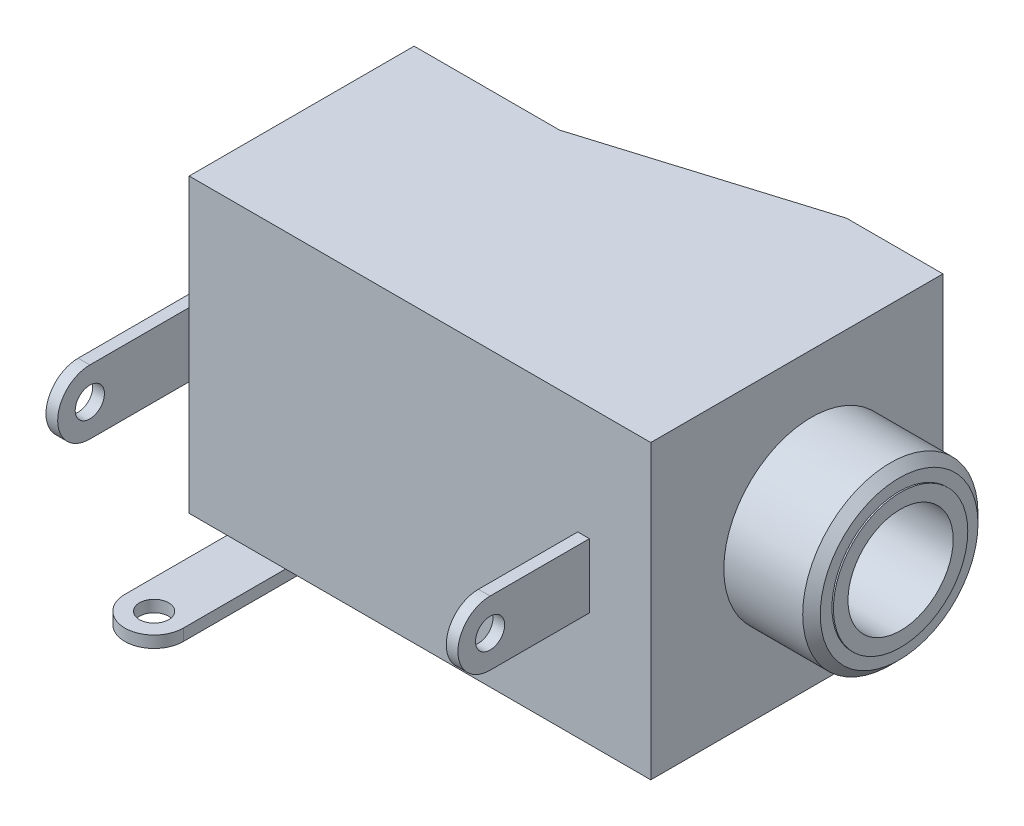
ISO-10303-21;
HEADER;
FILE_DESCRIPTION(('STEP AP214'),'2;1');
FILE_NAME('part.step','',(''),(''),'','','');
FILE_SCHEMA(('AUTOMOTIVE_DESIGN { 1 0 10303 214 1 1 1 1 }'));
ENDSEC;
DATA;
#1=APPLICATION_CONTEXT('core data for automotive mechanical design processes');
#2=APPLICATION_PROTOCOL_DEFINITION('international standard','automotive_design',2000,#1);
#3=PRODUCT_CONTEXT('',#1,'mechanical');
#4=PRODUCT('Part','Part','',(#3));
#5=PRODUCT_RELATED_PRODUCT_CATEGORY('part','',(#4));
#6=PRODUCT_DEFINITION_FORMATION('','',#4);
#7=PRODUCT_DEFINITION_CONTEXT('part definition',#1,'design');
#8=PRODUCT_DEFINITION('design','',#6,#7);
#9=PRODUCT_DEFINITION_SHAPE('','',#8);
#10=(LENGTH_UNIT() NAMED_UNIT(*) SI_UNIT(.MILLI.,.METRE.));
#11=(NAMED_UNIT(*) PLANE_ANGLE_UNIT() SI_UNIT($,.RADIAN.));
#12=(NAMED_UNIT(*) SI_UNIT($,.STERADIAN.) SOLID_ANGLE_UNIT());
#13=UNCERTAINTY_MEASURE_WITH_UNIT(LENGTH_MEASURE(1.E-05),#10,'distance_accuracy_value','');
#14=(GEOMETRIC_REPRESENTATION_CONTEXT(3) GLOBAL_UNCERTAINTY_ASSIGNED_CONTEXT((#13)) GLOBAL_UNIT_ASSIGNED_CONTEXT((#10,
#11,#12)) REPRESENTATION_CONTEXT('',''));
#15=CARTESIAN_POINT('',(0.,0.,0.));
#16=DIRECTION('',(0.,0.,1.));
#17=DIRECTION('',(1.,0.,0.));
#18=AXIS2_PLACEMENT_3D('',#15,#16,#17);
#19=CARTESIAN_POINT('',(0.,0.,5.3));
#20=DIRECTION('',(0.,0.,1.));
#21=DIRECTION('',(1.,0.,0.));
#22=AXIS2_PLACEMENT_3D('',#19,#20,#21);
#23=PLANE('',#22);
#24=DIRECTION('',(1.,0.,0.));
#25=VECTOR('',#24,1.);
#26=CARTESIAN_POINT('',(-18.8,-5.,5.3));
#27=LINE('',#26,#25);
#28=CARTESIAN_POINT('',(-17.5,-5.,5.3));
#29=VERTEX_POINT('',#28);
#30=CARTESIAN_POINT('',(-15.5,-5.,5.3));
#31=VERTEX_POINT('',#30);
#32=EDGE_CURVE('E269',#29,#31,#27,.T.);
#33=ORIENTED_EDGE('',*,*,#32,.T.);
#34=DIRECTION('',(-1.,0.,0.));
#35=VECTOR('',#34,1.);
#36=CARTESIAN_POINT('',(-3.,-4.99999999999995,5.3));
#37=LINE('',#36,#35);
#38=CARTESIAN_POINT('',(-3.,-4.99999999999995,5.3));
#39=VERTEX_POINT('',#38);
#40=EDGE_CURVE('E247',#39,#31,#37,.T.);
#41=ORIENTED_EDGE('',*,*,#40,.F.);
#42=DIRECTION('',(0.,-1.,0.));
#43=VECTOR('',#42,1.);
#44=CARTESIAN_POINT('',(-3.,-4.99999999999995,5.3));
#45=LINE('',#44,#43);
#46=CARTESIAN_POINT('',(-3.00000000000004,5.00000000000005,5.3));
#47=VERTEX_POINT('',#46);
#48=EDGE_CURVE('E242',#47,#39,#45,.T.);
#49=ORIENTED_EDGE('',*,*,#48,.F.);
#50=DIRECTION('',(1.,0.,0.));
#51=VECTOR('',#50,1.);
#52=CARTESIAN_POINT('',(-15.5,5.,5.3));
#53=LINE('',#52,#51);
#54=CARTESIAN_POINT('',(-18.8,5.,5.3));
#55=VERTEX_POINT('',#54);
#56=EDGE_CURVE('E256',#55,#47,#53,.T.);
#57=ORIENTED_EDGE('',*,*,#56,.F.);
#58=DIRECTION('',(0.,-1.,0.));
#59=VECTOR('',#58,1.);
#60=CARTESIAN_POINT('',(-18.8,5.,5.3));
#61=LINE('',#60,#59);
#62=CARTESIAN_POINT('',(-18.8,1.1,5.3));
#63=VERTEX_POINT('',#62);
#64=EDGE_CURVE('E258',#55,#63,#61,.T.);
#65=ORIENTED_EDGE('',*,*,#64,.T.);
#66=DIRECTION('',(0.,-1.,0.));
#67=VECTOR('',#66,1.);
#68=CARTESIAN_POINT('',(-18.8,1.1,5.3));
#69=LINE('',#68,#67);
#70=CARTESIAN_POINT('',(-18.8,-1.1,5.3));
#71=VERTEX_POINT('',#70);
#72=EDGE_CURVE('E266',#63,#71,#69,.T.);
#73=ORIENTED_EDGE('',*,*,#72,.T.);
#74=CARTESIAN_POINT('',(-18.8,-5.,5.3));
#75=VERTEX_POINT('',#74);
#76=EDGE_CURVE('E265',#71,#75,#69,.T.);
#77=ORIENTED_EDGE('',*,*,#76,.T.);
#78=EDGE_CURVE('E270',#75,#29,#27,.T.);
#79=ORIENTED_EDGE('',*,*,#78,.T.);
#80=EDGE_LOOP('',(#33,#41,#49,#57,#65,#73,#77,#79));
#81=FACE_BOUND('',#80,.T.);
#82=DIRECTION('',(1.,0.,0.));
#83=VECTOR('',#82,1.);
#84=CARTESIAN_POINT('',(-5.5,-1.1,5.3));
#85=LINE('',#84,#83);
#86=CARTESIAN_POINT('',(-5.5,-1.1,5.3));
#87=VERTEX_POINT('',#86);
#88=CARTESIAN_POINT('',(-5.1,-1.1,5.3));
#89=VERTEX_POINT('',#88);
#90=EDGE_CURVE('E61',#87,#89,#85,.T.);
#91=ORIENTED_EDGE('',*,*,#90,.F.);
#92=DIRECTION('',(0.,1.,0.));
#93=VECTOR('',#92,1.);
#94=CARTESIAN_POINT('',(-5.5,-1.1,5.3));
#95=LINE('',#94,#93);
#96=CARTESIAN_POINT('',(-5.5,1.1,5.3));
#97=VERTEX_POINT('',#96);
#98=EDGE_CURVE('E56',#87,#97,#95,.T.);
#99=ORIENTED_EDGE('',*,*,#98,.T.);
#100=DIRECTION('',(1.,0.,0.));
#101=VECTOR('',#100,1.);
#102=CARTESIAN_POINT('',(-5.5,1.1,5.3));
#103=LINE('',#102,#101);
#104=CARTESIAN_POINT('',(-5.1,1.1,5.3));
#105=VERTEX_POINT('',#104);
#106=EDGE_CURVE('E215',#97,#105,#103,.T.);
#107=ORIENTED_EDGE('',*,*,#106,.T.);
#108=DIRECTION('',(0.,1.,0.));
#109=VECTOR('',#108,1.);
#110=CARTESIAN_POINT('',(-5.1,-1.1,5.3));
#111=LINE('',#110,#109);
#112=EDGE_CURVE('E200',#89,#105,#111,.T.);
#113=ORIENTED_EDGE('',*,*,#112,.F.);
#114=EDGE_LOOP('',(#91,#99,#107,#113));
#115=FACE_BOUND('',#114,.T.);
#116=ADVANCED_FACE('F41',(#81,#115),#23,.T.);
#117=CARTESIAN_POINT('',(-15.5,-5.,0.));
#118=DIRECTION('',(-1.,0.,0.));
#119=DIRECTION('',(0.,-1.,0.));
#120=AXIS2_PLACEMENT_3D('',#117,#118,#119);
#121=PLANE('',#120);
#122=DIRECTION('',(0.,0.,-1.));
#123=VECTOR('',#122,1.);
#124=CARTESIAN_POINT('',(-15.5,-5.,-4.7));
#125=LINE('',#124,#123);
#126=CARTESIAN_POINT('',(-15.5,-5.,0.));
#127=VERTEX_POINT('',#126);
#128=EDGE_CURVE('E232',#31,#127,#125,.T.);
#129=ORIENTED_EDGE('',*,*,#128,.F.);
#130=DIRECTION('',(0.,0.,-1.));
#131=VECTOR('',#130,1.);
#132=CARTESIAN_POINT('',(-15.5,-5.,9.8));
#133=LINE('',#132,#131);
#134=CARTESIAN_POINT('',(-15.5,-5.,8.8));
#135=VERTEX_POINT('',#134);
#136=EDGE_CURVE('E467',#31,#135,#133,.F.);
#137=ORIENTED_EDGE('',*,*,#136,.T.);
#138=DIRECTION('',(0.,1.,0.));
#139=VECTOR('',#138,1.);
#140=CARTESIAN_POINT('',(-15.5,-5.4,8.8));
#141=LINE('',#140,#139);
#142=CARTESIAN_POINT('',(-15.5,-5.4,8.8));
#143=VERTEX_POINT('',#142);
#144=EDGE_CURVE('E305',#143,#135,#141,.T.);
#145=ORIENTED_EDGE('',*,*,#144,.F.);
#146=DIRECTION('',(0.,0.,1.));
#147=VECTOR('',#146,1.);
#148=CARTESIAN_POINT('',(-15.5,-5.4,0.));
#149=LINE('',#148,#147);
#150=CARTESIAN_POINT('',(-15.5,-5.4,0.489897948556634));
#151=VERTEX_POINT('',#150);
#152=EDGE_CURVE('E310',#151,#143,#149,.T.);
#153=ORIENTED_EDGE('',*,*,#152,.F.);
#154=CARTESIAN_POINT('',(-15.5,-4.9,0.489897948556634));
#155=DIRECTION('',(1.,0.,0.));
#156=DIRECTION('',(0.,0.,-1.));
#157=AXIS2_PLACEMENT_3D('',#154,#155,#156);
#158=CIRCLE('',#157,0.5);
#159=EDGE_CURVE('E447',#127,#151,#158,.F.);
#160=ORIENTED_EDGE('',*,*,#159,.F.);
#161=EDGE_LOOP('',(#129,#137,#145,#153,#160));
#162=FACE_BOUND('',#161,.T.);
#163=ADVANCED_FACE('F498',(#162),#121,.F.);
#164=CARTESIAN_POINT('',(-18.8,1.1,9.8));
#165=DIRECTION('',(0.,-1.,0.));
#166=DIRECTION('',(0.,0.,-1.));
#167=AXIS2_PLACEMENT_3D('',#164,#165,#166);
#168=PLANE('',#167);
#169=DIRECTION('',(0.,0.,1.));
#170=VECTOR('',#169,1.);
#171=CARTESIAN_POINT('',(-18.8,1.1,5.3));
#172=LINE('',#171,#170);
#173=CARTESIAN_POINT('',(-18.8,1.1,3.55));
#174=VERTEX_POINT('',#173);
#175=EDGE_CURVE('E250',#174,#63,#172,.T.);
#176=ORIENTED_EDGE('',*,*,#175,.F.);
#177=CARTESIAN_POINT('',(-18.7,1.1,4.03989794855663));
#178=DIRECTION('',(0.,1.,0.));
#179=DIRECTION('',(0.,0.,1.));
#180=AXIS2_PLACEMENT_3D('',#177,#178,#179);
#181=CIRCLE('',#180,0.5);
#182=CARTESIAN_POINT('',(-19.2,1.1,4.03989794855663));
#183=VERTEX_POINT('',#182);
#184=EDGE_CURVE('E452',#183,#174,#181,.F.);
#185=ORIENTED_EDGE('',*,*,#184,.F.);
#186=DIRECTION('',(0.,0.,-1.));
#187=VECTOR('',#186,1.);
#188=CARTESIAN_POINT('',(-19.2,1.1,9.8));
#189=LINE('',#188,#187);
#190=CARTESIAN_POINT('',(-19.2,1.1,8.7));
#191=VERTEX_POINT('',#190);
#192=EDGE_CURVE('E399',#191,#183,#189,.T.);
#193=ORIENTED_EDGE('',*,*,#192,.F.);
#194=DIRECTION('',(1.,0.,0.));
#195=VECTOR('',#194,1.);
#196=CARTESIAN_POINT('',(-18.8,1.1,8.7));
#197=LINE('',#196,#195);
#198=CARTESIAN_POINT('',(-18.8,1.1,8.7));
#199=VERTEX_POINT('',#198);
#200=EDGE_CURVE('E395',#199,#191,#197,.F.);
#201=ORIENTED_EDGE('',*,*,#200,.F.);
#202=DIRECTION('',(0.,0.,1.));
#203=VECTOR('',#202,1.);
#204=CARTESIAN_POINT('',(-18.8,1.1,5.3));
#205=LINE('',#204,#203);
#206=EDGE_CURVE('E273',#63,#199,#205,.T.);
#207=ORIENTED_EDGE('',*,*,#206,.F.);
#208=EDGE_LOOP('',(#176,#185,#193,#201,#207));
#209=FACE_BOUND('',#208,.T.);
#210=ADVANCED_FACE('F562',(#209),#168,.F.);
#211=CARTESIAN_POINT('',(-18.8,5.,5.3));
#212=DIRECTION('',(1.,0.,0.));
#213=DIRECTION('',(0.,0.,-1.));
#214=AXIS2_PLACEMENT_3D('',#211,#212,#213);
#215=PLANE('',#214);
#216=DIRECTION('',(0.,0.,1.));
#217=VECTOR('',#216,1.);
#218=CARTESIAN_POINT('',(-18.8,5.,5.3));
#219=LINE('',#218,#217);
#220=CARTESIAN_POINT('',(-18.8,5.00000000000005,-2.4));
#221=VERTEX_POINT('',#220);
#222=EDGE_CURVE('E254',#221,#55,#219,.T.);
#223=ORIENTED_EDGE('',*,*,#222,.F.);
#224=DIRECTION('',(0.,-1.,0.));
#225=VECTOR('',#224,1.);
#226=CARTESIAN_POINT('',(-18.8,5.00000000000005,-2.4));
#227=LINE('',#226,#225);
#228=CARTESIAN_POINT('',(-18.8,-5.,-2.4));
#229=VERTEX_POINT('',#228);
#230=EDGE_CURVE('E229',#221,#229,#227,.T.);
#231=ORIENTED_EDGE('',*,*,#230,.T.);
#232=DIRECTION('',(0.,0.,1.));
#233=VECTOR('',#232,1.);
#234=CARTESIAN_POINT('',(-18.8,-5.,5.3));
#235=LINE('',#234,#233);
#236=EDGE_CURVE('E300',#229,#75,#235,.T.);
#237=ORIENTED_EDGE('',*,*,#236,.T.);
#238=ORIENTED_EDGE('',*,*,#76,.F.);
#239=DIRECTION('',(0.,0.,-1.));
#240=VECTOR('',#239,1.);
#241=CARTESIAN_POINT('',(-18.8,-1.1,5.3));
#242=LINE('',#241,#240);
#243=CARTESIAN_POINT('',(-18.8,-1.1,3.55));
#244=VERTEX_POINT('',#243);
#245=EDGE_CURVE('E389',#244,#71,#242,.F.);
#246=ORIENTED_EDGE('',*,*,#245,.F.);
#247=DIRECTION('',(0.,1.,0.));
#248=VECTOR('',#247,1.);
#249=CARTESIAN_POINT('',(-18.8,5.,3.55));
#250=LINE('',#249,#248);
#251=EDGE_CURVE('E519',#174,#244,#250,.F.);
#252=ORIENTED_EDGE('',*,*,#251,.F.);
#253=ORIENTED_EDGE('',*,*,#175,.T.);
#254=ORIENTED_EDGE('',*,*,#64,.F.);
#255=EDGE_LOOP('',(#223,#231,#237,#238,#246,#252,#253,#254));
#256=FACE_BOUND('',#255,.T.);
#257=ADVANCED_FACE('F575',(#256),#215,.F.);
#258=CARTESIAN_POINT('',(-3.,-5.,5.3));
#259=DIRECTION('',(0.,1.,0.));
#260=DIRECTION('',(0.,0.,1.));
#261=AXIS2_PLACEMENT_3D('',#258,#259,#260);
#262=PLANE('',#261);
#263=ORIENTED_EDGE('',*,*,#236,.F.);
#264=DIRECTION('',(-1.,0.,0.));
#265=VECTOR('',#264,1.);
#266=CARTESIAN_POINT('',(-13.8229610225135,-5.,-2.4));
#267=LINE('',#266,#265);
#268=CARTESIAN_POINT('',(-13.8229610225135,-5.,-2.4));
#269=VERTEX_POINT('',#268);
#270=EDGE_CURVE('E222',#269,#229,#267,.T.);
#271=ORIENTED_EDGE('',*,*,#270,.F.);
#272=DIRECTION('',(-0.956313472988415,0.,0.2923431910971));
#273=VECTOR('',#272,1.);
#274=CARTESIAN_POINT('',(-6.29919766883652,-5.,-4.7));
#275=LINE('',#274,#273);
#276=CARTESIAN_POINT('',(-6.29919766883652,-5.,-4.7));
#277=VERTEX_POINT('',#276);
#278=EDGE_CURVE('E214',#277,#269,#275,.T.);
#279=ORIENTED_EDGE('',*,*,#278,.F.);
#280=DIRECTION('',(-1.,0.,0.));
#281=VECTOR('',#280,1.);
#282=CARTESIAN_POINT('',(-18.8,-5.,-4.7));
#283=LINE('',#282,#281);
#284=CARTESIAN_POINT('',(-3.,-4.99999999999995,-4.7));
#285=VERTEX_POINT('',#284);
#286=EDGE_CURVE('E262',#285,#277,#283,.T.);
#287=ORIENTED_EDGE('',*,*,#286,.F.);
#288=DIRECTION('',(0.,0.,-1.));
#289=VECTOR('',#288,1.);
#290=CARTESIAN_POINT('',(-3.,-4.99999999999995,-4.7));
#291=LINE('',#290,#289);
#292=EDGE_CURVE('E244',#39,#285,#291,.T.);
#293=ORIENTED_EDGE('',*,*,#292,.F.);
#294=ORIENTED_EDGE('',*,*,#40,.T.);
#295=ORIENTED_EDGE('',*,*,#128,.T.);
#296=DIRECTION('',(1.,0.,0.));
#297=VECTOR('',#296,1.);
#298=CARTESIAN_POINT('',(-3.,-5.,0.));
#299=LINE('',#298,#297);
#300=CARTESIAN_POINT('',(-17.5,-5.,0.));
#301=VERTEX_POINT('',#300);
#302=EDGE_CURVE('E379',#301,#127,#299,.T.);
#303=ORIENTED_EDGE('',*,*,#302,.F.);
#304=DIRECTION('',(0.,0.,1.));
#305=VECTOR('',#304,1.);
#306=CARTESIAN_POINT('',(-17.5,-5.,5.3));
#307=LINE('',#306,#305);
#308=EDGE_CURVE('E384',#29,#301,#307,.F.);
#309=ORIENTED_EDGE('',*,*,#308,.F.);
#310=ORIENTED_EDGE('',*,*,#78,.F.);
#311=EDGE_LOOP('',(#263,#271,#279,#287,#293,#294,#295,#303,#309,#310));
#312=FACE_BOUND('',#311,.T.);
#313=ADVANCED_FACE('F542',(#312),#262,.F.);
#314=CARTESIAN_POINT('',(-18.8,-1.1,9.8));
#315=DIRECTION('',(-1.,0.,0.));
#316=DIRECTION('',(0.,0.,1.));
#317=AXIS2_PLACEMENT_3D('',#314,#315,#316);
#318=PLANE('',#317);
#319=CARTESIAN_POINT('',(-18.8,0.,8.7));
#320=DIRECTION('',(1.,0.,0.));
#321=DIRECTION('',(0.,0.,-1.));
#322=AXIS2_PLACEMENT_3D('',#319,#320,#321);
#323=CIRCLE('',#322,0.499999999999988);
#324=CARTESIAN_POINT('',(-18.8,0.,8.20000000000001));
#325=VERTEX_POINT('',#324);
#326=EDGE_CURVE('E1017',#325,#325,#323,.T.);
#327=ORIENTED_EDGE('',*,*,#326,.F.);
#328=EDGE_LOOP('',(#327));
#329=FACE_BOUND('',#328,.T.);
#330=CARTESIAN_POINT('',(-18.8,0.,8.7));
#331=DIRECTION('',(-1.,0.,0.));
#332=DIRECTION('',(0.,0.,1.));
#333=AXIS2_PLACEMENT_3D('',#330,#331,#332);
#334=CIRCLE('',#333,1.1);
#335=CARTESIAN_POINT('',(-18.8,-1.1,8.7));
#336=VERTEX_POINT('',#335);
#337=EDGE_CURVE('E402',#336,#199,#334,.T.);
#338=ORIENTED_EDGE('',*,*,#337,.F.);
#339=DIRECTION('',(0.,0.,1.));
#340=VECTOR('',#339,1.);
#341=CARTESIAN_POINT('',(-18.8,-1.1,9.8));
#342=LINE('',#341,#340);
#343=EDGE_CURVE('E274',#71,#336,#342,.T.);
#344=ORIENTED_EDGE('',*,*,#343,.F.);
#345=ORIENTED_EDGE('',*,*,#72,.F.);
#346=ORIENTED_EDGE('',*,*,#206,.T.);
#347=EDGE_LOOP('',(#338,#344,#345,#346));
#348=FACE_BOUND('',#347,.T.);
#349=ADVANCED_FACE('F605',(#329,#348),#318,.F.);
#350=CARTESIAN_POINT('',(-15.5,-5.,9.8));
#351=DIRECTION('',(0.,-1.,0.));
#352=DIRECTION('',(0.,0.,-1.));
#353=AXIS2_PLACEMENT_3D('',#350,#351,#352);
#354=PLANE('',#353);
#355=CARTESIAN_POINT('',(-16.5,-5.,8.8));
#356=DIRECTION('',(0.,1.,0.));
#357=DIRECTION('',(0.,0.,1.));
#358=AXIS2_PLACEMENT_3D('',#355,#356,#357);
#359=CIRCLE('',#358,0.499999999999987);
#360=CARTESIAN_POINT('',(-16.5,-5.,9.29999999999999));
#361=VERTEX_POINT('',#360);
#362=EDGE_CURVE('E1022',#361,#361,#359,.T.);
#363=ORIENTED_EDGE('',*,*,#362,.F.);
#364=EDGE_LOOP('',(#363));
#365=FACE_BOUND('',#364,.T.);
#366=ORIENTED_EDGE('',*,*,#136,.F.);
#367=ORIENTED_EDGE('',*,*,#32,.F.);
#368=DIRECTION('',(0.,0.,-1.));
#369=VECTOR('',#368,1.);
#370=CARTESIAN_POINT('',(-17.5,-5.,9.8));
#371=LINE('',#370,#369);
#372=CARTESIAN_POINT('',(-17.5,-5.,8.8));
#373=VERTEX_POINT('',#372);
#374=EDGE_CURVE('E278',#373,#29,#371,.T.);
#375=ORIENTED_EDGE('',*,*,#374,.F.);
#376=CARTESIAN_POINT('',(-16.5,-5.,8.8));
#377=DIRECTION('',(0.,1.,0.));
#378=DIRECTION('',(0.,0.,1.));
#379=AXIS2_PLACEMENT_3D('',#376,#377,#378);
#380=CIRCLE('',#379,1.);
#381=EDGE_CURVE('E282',#135,#373,#380,.F.);
#382=ORIENTED_EDGE('',*,*,#381,.F.);
#383=EDGE_LOOP('',(#366,#367,#375,#382));
#384=FACE_BOUND('',#383,.T.);
#385=ADVANCED_FACE('F505',(#365,#384),#354,.F.);
#386=CARTESIAN_POINT('',(-19.2,-1.1,9.8));
#387=DIRECTION('',(1.,0.,0.));
#388=DIRECTION('',(0.,0.,-1.));
#389=AXIS2_PLACEMENT_3D('',#386,#387,#388);
#390=PLANE('',#389);
#391=CARTESIAN_POINT('',(-19.2,0.,8.7));
#392=DIRECTION('',(1.,0.,0.));
#393=DIRECTION('',(0.,0.,-1.));
#394=AXIS2_PLACEMENT_3D('',#391,#392,#393);
#395=CIRCLE('',#394,0.499999999999988);
#396=CARTESIAN_POINT('',(-19.2,0.,8.20000000000001));
#397=VERTEX_POINT('',#396);
#398=EDGE_CURVE('E1018',#397,#397,#395,.T.);
#399=ORIENTED_EDGE('',*,*,#398,.T.);
#400=EDGE_LOOP('',(#399));
#401=FACE_BOUND('',#400,.T.);
#402=DIRECTION('',(0.,1.,0.));
#403=VECTOR('',#402,1.);
#404=CARTESIAN_POINT('',(-19.2,1.1,4.03989794855663));
#405=LINE('',#404,#403);
#406=CARTESIAN_POINT('',(-19.2,-1.1,4.03989794855663));
#407=VERTEX_POINT('',#406);
#408=EDGE_CURVE('E443',#407,#183,#405,.T.);
#409=ORIENTED_EDGE('',*,*,#408,.F.);
#410=DIRECTION('',(0.,0.,1.));
#411=VECTOR('',#410,1.);
#412=CARTESIAN_POINT('',(-19.2,-1.1,9.8));
#413=LINE('',#412,#411);
#414=CARTESIAN_POINT('',(-19.2,-1.1,8.7));
#415=VERTEX_POINT('',#414);
#416=EDGE_CURVE('E448',#407,#415,#413,.T.);
#417=ORIENTED_EDGE('',*,*,#416,.T.);
#418=CARTESIAN_POINT('',(-19.2,0.,8.7));
#419=DIRECTION('',(-1.,0.,0.));
#420=DIRECTION('',(0.,0.,1.));
#421=AXIS2_PLACEMENT_3D('',#418,#419,#420);
#422=CIRCLE('',#421,1.1);
#423=EDGE_CURVE('E277',#191,#415,#422,.F.);
#424=ORIENTED_EDGE('',*,*,#423,.F.);
#425=ORIENTED_EDGE('',*,*,#192,.T.);
#426=EDGE_LOOP('',(#409,#417,#424,#425));
#427=FACE_BOUND('',#426,.T.);
#428=ADVANCED_FACE('F628',(#401,#427),#390,.F.);
#429=CARTESIAN_POINT('',(-15.5,-5.4,0.));
#430=DIRECTION('',(0.,1.,0.));
#431=DIRECTION('',(0.,0.,1.));
#432=AXIS2_PLACEMENT_3D('',#429,#430,#431);
#433=PLANE('',#432);
#434=CARTESIAN_POINT('',(-16.5,-5.4,8.8));
#435=DIRECTION('',(0.,1.,0.));
#436=DIRECTION('',(0.,0.,1.));
#437=AXIS2_PLACEMENT_3D('',#434,#435,#436);
#438=CIRCLE('',#437,0.499999999999987);
#439=CARTESIAN_POINT('',(-16.5,-5.4,9.29999999999999));
#440=VERTEX_POINT('',#439);
#441=EDGE_CURVE('E1031',#440,#440,#438,.T.);
#442=ORIENTED_EDGE('',*,*,#441,.T.);
#443=EDGE_LOOP('',(#442));
#444=FACE_BOUND('',#443,.T.);
#445=DIRECTION('',(1.,0.,0.));
#446=VECTOR('',#445,1.);
#447=CARTESIAN_POINT('',(-17.5,-5.4,0.489897948556635));
#448=LINE('',#447,#446);
#449=CARTESIAN_POINT('',(-17.5,-5.4,0.489897948556634));
#450=VERTEX_POINT('',#449);
#451=EDGE_CURVE('E445',#151,#450,#448,.F.);
#452=ORIENTED_EDGE('',*,*,#451,.F.);
#453=ORIENTED_EDGE('',*,*,#152,.T.);
#454=CARTESIAN_POINT('',(-16.5,-5.4,8.8));
#455=DIRECTION('',(0.,1.,0.));
#456=DIRECTION('',(0.,0.,1.));
#457=AXIS2_PLACEMENT_3D('',#454,#455,#456);
#458=CIRCLE('',#457,1.);
#459=CARTESIAN_POINT('',(-17.5,-5.4,8.8));
#460=VERTEX_POINT('',#459);
#461=EDGE_CURVE('E309',#460,#143,#458,.T.);
#462=ORIENTED_EDGE('',*,*,#461,.F.);
#463=DIRECTION('',(0.,0.,-1.));
#464=VECTOR('',#463,1.);
#465=CARTESIAN_POINT('',(-17.5,-5.4,0.));
#466=LINE('',#465,#464);
#467=EDGE_CURVE('E293',#460,#450,#466,.T.);
#468=ORIENTED_EDGE('',*,*,#467,.T.);
#469=EDGE_LOOP('',(#452,#453,#462,#468));
#470=FACE_BOUND('',#469,.T.);
#471=ADVANCED_FACE('F493',(#444,#470),#433,.F.);
#472=CARTESIAN_POINT('',(-18.8,0.,8.7));
#473=DIRECTION('',(-1.,0.,0.));
#474=DIRECTION('',(0.,0.,1.));
#475=AXIS2_PLACEMENT_3D('',#472,#473,#474);
#476=CYLINDRICAL_SURFACE('',#475,1.1);
#477=ORIENTED_EDGE('',*,*,#200,.T.);
#478=ORIENTED_EDGE('',*,*,#423,.T.);
#479=DIRECTION('',(1.,0.,0.));
#480=VECTOR('',#479,1.);
#481=CARTESIAN_POINT('',(-18.8,-1.1,8.7));
#482=LINE('',#481,#480);
#483=EDGE_CURVE('E461',#415,#336,#482,.T.);
#484=ORIENTED_EDGE('',*,*,#483,.T.);
#485=ORIENTED_EDGE('',*,*,#337,.T.);
#486=EDGE_LOOP('',(#477,#478,#484,#485));
#487=FACE_BOUND('',#486,.T.);
#488=ADVANCED_FACE('F879',(#487),#476,.T.);
#489=CARTESIAN_POINT('',(-18.7,1.1,4.03989794855663));
#490=DIRECTION('',(0.,1.,0.));
#491=DIRECTION('',(0.,0.,1.));
#492=AXIS2_PLACEMENT_3D('',#489,#490,#491);
#493=CYLINDRICAL_SURFACE('',#492,0.5);
#494=ORIENTED_EDGE('',*,*,#184,.T.);
#495=ORIENTED_EDGE('',*,*,#251,.T.);
#496=CARTESIAN_POINT('',(-18.7,-1.1,4.03989794855663));
#497=DIRECTION('',(0.,1.,0.));
#498=DIRECTION('',(0.,0.,1.));
#499=AXIS2_PLACEMENT_3D('',#496,#497,#498);
#500=CIRCLE('',#499,0.5);
#501=EDGE_CURVE('E466',#244,#407,#500,.T.);
#502=ORIENTED_EDGE('',*,*,#501,.T.);
#503=ORIENTED_EDGE('',*,*,#408,.T.);
#504=EDGE_LOOP('',(#494,#495,#502,#503));
#505=FACE_BOUND('',#504,.T.);
#506=ADVANCED_FACE('F872',(#505),#493,.T.);
#507=CARTESIAN_POINT('',(-18.8,-1.1,9.8));
#508=DIRECTION('',(0.,1.,0.));
#509=DIRECTION('',(0.,0.,1.));
#510=AXIS2_PLACEMENT_3D('',#507,#508,#509);
#511=PLANE('',#510);
#512=ORIENTED_EDGE('',*,*,#501,.F.);
#513=ORIENTED_EDGE('',*,*,#245,.T.);
#514=ORIENTED_EDGE('',*,*,#343,.T.);
#515=ORIENTED_EDGE('',*,*,#483,.F.);
#516=ORIENTED_EDGE('',*,*,#416,.F.);
#517=EDGE_LOOP('',(#512,#513,#514,#515,#516));
#518=FACE_BOUND('',#517,.T.);
#519=ADVANCED_FACE('F866',(#518),#511,.F.);
#520=CARTESIAN_POINT('',(-17.5,-4.9,0.489897948556634));
#521=DIRECTION('',(1.,0.,0.));
#522=DIRECTION('',(0.,0.,-1.));
#523=AXIS2_PLACEMENT_3D('',#520,#521,#522);
#524=CYLINDRICAL_SURFACE('',#523,0.5);
#525=CARTESIAN_POINT('',(-17.5,-4.9,0.489897948556634));
#526=DIRECTION('',(1.,0.,0.));
#527=DIRECTION('',(0.,0.,-1.));
#528=AXIS2_PLACEMENT_3D('',#525,#526,#527);
#529=CIRCLE('',#528,0.5);
#530=EDGE_CURVE('E298',#450,#301,#529,.T.);
#531=ORIENTED_EDGE('',*,*,#530,.T.);
#532=ORIENTED_EDGE('',*,*,#302,.T.);
#533=ORIENTED_EDGE('',*,*,#159,.T.);
#534=ORIENTED_EDGE('',*,*,#451,.T.);
#535=EDGE_LOOP('',(#531,#532,#533,#534));
#536=FACE_BOUND('',#535,.T.);
#537=ADVANCED_FACE('F537',(#536),#524,.T.);
#538=CARTESIAN_POINT('',(-16.5,-5.4,8.8));
#539=DIRECTION('',(0.,1.,0.));
#540=DIRECTION('',(0.,0.,1.));
#541=AXIS2_PLACEMENT_3D('',#538,#539,#540);
#542=CYLINDRICAL_SURFACE('',#541,1.);
#543=ORIENTED_EDGE('',*,*,#144,.T.);
#544=ORIENTED_EDGE('',*,*,#381,.T.);
#545=DIRECTION('',(0.,1.,0.));
#546=VECTOR('',#545,1.);
#547=CARTESIAN_POINT('',(-17.5,-5.4,8.8));
#548=LINE('',#547,#546);
#549=EDGE_CURVE('E299',#373,#460,#548,.F.);
#550=ORIENTED_EDGE('',*,*,#549,.T.);
#551=ORIENTED_EDGE('',*,*,#461,.T.);
#552=EDGE_LOOP('',(#543,#544,#550,#551));
#553=FACE_BOUND('',#552,.T.);
#554=ADVANCED_FACE('F502',(#553),#542,.T.);
#555=CARTESIAN_POINT('',(-17.5,-5.4,0.));
#556=DIRECTION('',(1.,0.,0.));
#557=DIRECTION('',(0.,0.,-1.));
#558=AXIS2_PLACEMENT_3D('',#555,#556,#557);
#559=PLANE('',#558);
#560=ORIENTED_EDGE('',*,*,#530,.F.);
#561=ORIENTED_EDGE('',*,*,#467,.F.);
#562=ORIENTED_EDGE('',*,*,#549,.F.);
#563=ORIENTED_EDGE('',*,*,#374,.T.);
#564=ORIENTED_EDGE('',*,*,#308,.T.);
#565=EDGE_LOOP('',(#560,#561,#562,#563,#564));
#566=FACE_BOUND('',#565,.T.);
#567=ADVANCED_FACE('F625',(#566),#559,.F.);
#568=CARTESIAN_POINT('',(0.,0.,-4.7));
#569=DIRECTION('',(0.,0.,1.));
#570=DIRECTION('',(0.,-1.,0.));
#571=AXIS2_PLACEMENT_3D('',#568,#569,#570);
#572=PLANE('',#571);
#573=ORIENTED_EDGE('',*,*,#286,.T.);
#574=DIRECTION('',(0.,-1.,0.));
#575=VECTOR('',#574,1.);
#576=CARTESIAN_POINT('',(-6.29919766883652,5.00000000000005,-4.7));
#577=LINE('',#576,#575);
#578=CARTESIAN_POINT('',(-6.29919766883652,5.00000000000005,-4.7));
#579=VERTEX_POINT('',#578);
#580=EDGE_CURVE('E225',#579,#277,#577,.T.);
#581=ORIENTED_EDGE('',*,*,#580,.F.);
#582=DIRECTION('',(-1.,0.,0.));
#583=VECTOR('',#582,1.);
#584=CARTESIAN_POINT('',(-18.8,5.,-4.7));
#585=LINE('',#584,#583);
#586=CARTESIAN_POINT('',(-3.00000000000004,5.00000000000005,-4.7));
#587=VERTEX_POINT('',#586);
#588=EDGE_CURVE('E251',#587,#579,#585,.T.);
#589=ORIENTED_EDGE('',*,*,#588,.F.);
#590=DIRECTION('',(0.,1.,0.));
#591=VECTOR('',#590,1.);
#592=CARTESIAN_POINT('',(-3.00000000000004,5.00000000000005,-4.7));
#593=LINE('',#592,#591);
#594=EDGE_CURVE('E236',#285,#587,#593,.T.);
#595=ORIENTED_EDGE('',*,*,#594,.F.);
#596=EDGE_LOOP('',(#573,#581,#589,#595));
#597=FACE_BOUND('',#596,.T.);
#598=ADVANCED_FACE('F619',(#597),#572,.F.);
#599=CARTESIAN_POINT('',(0.,5.,0.));
#600=DIRECTION('',(0.,-1.,0.));
#601=DIRECTION('',(0.,0.,-1.));
#602=AXIS2_PLACEMENT_3D('',#599,#600,#601);
#603=PLANE('',#602);
#604=DIRECTION('',(-0.956313472988415,0.,0.2923431910971));
#605=VECTOR('',#604,1.);
#606=CARTESIAN_POINT('',(-6.29919766883652,5.00000000000005,-4.7));
#607=LINE('',#606,#605);
#608=CARTESIAN_POINT('',(-13.8229610225135,5.,-2.4));
#609=VERTEX_POINT('',#608);
#610=EDGE_CURVE('E218',#579,#609,#607,.T.);
#611=ORIENTED_EDGE('',*,*,#610,.T.);
#612=DIRECTION('',(-1.,0.,0.));
#613=VECTOR('',#612,1.);
#614=CARTESIAN_POINT('',(-13.8229610225135,5.00000000000005,-2.4));
#615=LINE('',#614,#613);
#616=EDGE_CURVE('E221',#609,#221,#615,.T.);
#617=ORIENTED_EDGE('',*,*,#616,.T.);
#618=ORIENTED_EDGE('',*,*,#222,.T.);
#619=ORIENTED_EDGE('',*,*,#56,.T.);
#620=DIRECTION('',(0.,0.,1.));
#621=VECTOR('',#620,1.);
#622=CARTESIAN_POINT('',(-3.00000000000004,5.00000000000005,5.3));
#623=LINE('',#622,#621);
#624=EDGE_CURVE('E239',#587,#47,#623,.T.);
#625=ORIENTED_EDGE('',*,*,#624,.F.);
#626=ORIENTED_EDGE('',*,*,#588,.T.);
#627=EDGE_LOOP('',(#611,#617,#618,#619,#625,#626));
#628=FACE_BOUND('',#627,.T.);
#629=ADVANCED_FACE('F624',(#628),#603,.F.);
#630=CARTESIAN_POINT('',(-3.00000000000002,0.,0.));
#631=DIRECTION('',(-1.,0.,0.));
#632=DIRECTION('',(0.,-1.,0.));
#633=AXIS2_PLACEMENT_3D('',#630,#631,#632);
#634=PLANE('',#633);
#635=CARTESIAN_POINT('',(-3.,0.,-0.2));
#636=DIRECTION('',(1.,0.,0.));
#637=DIRECTION('',(0.,0.,-1.));
#638=AXIS2_PLACEMENT_3D('',#635,#636,#637);
#639=CIRCLE('',#638,3.);
#640=CARTESIAN_POINT('',(-3.,0.,-3.2));
#641=VERTEX_POINT('',#640);
#642=EDGE_CURVE('E203',#641,#641,#639,.T.);
#643=ORIENTED_EDGE('',*,*,#642,.F.);
#644=EDGE_LOOP('',(#643));
#645=FACE_BOUND('',#644,.T.);
#646=ORIENTED_EDGE('',*,*,#594,.T.);
#647=ORIENTED_EDGE('',*,*,#624,.T.);
#648=ORIENTED_EDGE('',*,*,#48,.T.);
#649=ORIENTED_EDGE('',*,*,#292,.T.);
#650=EDGE_LOOP('',(#646,#647,#648,#649));
#651=FACE_BOUND('',#650,.T.);
#652=ADVANCED_FACE('F645',(#645,#651),#634,.F.);
#653=CARTESIAN_POINT('',(-13.8229610225135,5.00000000000005,-2.4));
#654=DIRECTION('',(0.,0.,1.));
#655=DIRECTION('',(1.,0.,0.));
#656=AXIS2_PLACEMENT_3D('',#653,#654,#655);
#657=PLANE('',#656);
#658=ORIENTED_EDGE('',*,*,#270,.T.);
#659=ORIENTED_EDGE('',*,*,#230,.F.);
#660=ORIENTED_EDGE('',*,*,#616,.F.);
#661=DIRECTION('',(0.,-1.,0.));
#662=VECTOR('',#661,1.);
#663=CARTESIAN_POINT('',(-13.8229610225135,5.00000000000005,-2.4));
#664=LINE('',#663,#662);
#665=EDGE_CURVE('E233',#609,#269,#664,.T.);
#666=ORIENTED_EDGE('',*,*,#665,.T.);
#667=EDGE_LOOP('',(#658,#659,#660,#666));
#668=FACE_BOUND('',#667,.T.);
#669=ADVANCED_FACE('F663',(#668),#657,.F.);
#670=CARTESIAN_POINT('',(-6.29919766883652,5.00000000000005,-4.7));
#671=DIRECTION('',(0.2923431910971,0.,0.956313472988415));
#672=DIRECTION('',(0.956313472988415,0.,-0.2923431910971));
#673=AXIS2_PLACEMENT_3D('',#670,#671,#672);
#674=PLANE('',#673);
#675=ORIENTED_EDGE('',*,*,#278,.T.);
#676=ORIENTED_EDGE('',*,*,#665,.F.);
#677=ORIENTED_EDGE('',*,*,#610,.F.);
#678=ORIENTED_EDGE('',*,*,#580,.T.);
#679=EDGE_LOOP('',(#675,#676,#677,#678));
#680=FACE_BOUND('',#679,.T.);
#681=ADVANCED_FACE('F673',(#680),#674,.F.);
#682=CARTESIAN_POINT('',(-5.5,0.,8.7));
#683=DIRECTION('',(1.,0.,0.));
#684=DIRECTION('',(0.,0.,-1.));
#685=AXIS2_PLACEMENT_3D('',#682,#683,#684);
#686=CYLINDRICAL_SURFACE('',#685,1.1);
#687=CARTESIAN_POINT('',(-5.1,0.,8.7));
#688=DIRECTION('',(1.,0.,0.));
#689=DIRECTION('',(0.,0.,-1.));
#690=AXIS2_PLACEMENT_3D('',#687,#688,#689);
#691=CIRCLE('',#690,1.1);
#692=CARTESIAN_POINT('',(-5.1,1.1,8.7));
#693=VERTEX_POINT('',#692);
#694=CARTESIAN_POINT('',(-5.1,-1.1,8.7));
#695=VERTEX_POINT('',#694);
#696=EDGE_CURVE('E208',#693,#695,#691,.T.);
#697=ORIENTED_EDGE('',*,*,#696,.F.);
#698=DIRECTION('',(1.,0.,0.));
#699=VECTOR('',#698,1.);
#700=CARTESIAN_POINT('',(-5.5,1.1,8.7));
#701=LINE('',#700,#699);
#702=CARTESIAN_POINT('',(-5.5,1.1,8.7));
#703=VERTEX_POINT('',#702);
#704=EDGE_CURVE('E196',#703,#693,#701,.T.);
#705=ORIENTED_EDGE('',*,*,#704,.F.);
#706=CARTESIAN_POINT('',(-5.5,0.,8.7));
#707=DIRECTION('',(1.,0.,0.));
#708=DIRECTION('',(0.,0.,-1.));
#709=AXIS2_PLACEMENT_3D('',#706,#707,#708);
#710=CIRCLE('',#709,1.1);
#711=CARTESIAN_POINT('',(-5.5,-1.1,8.7));
#712=VERTEX_POINT('',#711);
#713=EDGE_CURVE('E192',#703,#712,#710,.T.);
#714=ORIENTED_EDGE('',*,*,#713,.T.);
#715=DIRECTION('',(1.,0.,0.));
#716=VECTOR('',#715,1.);
#717=CARTESIAN_POINT('',(-5.5,-1.1,8.7));
#718=LINE('',#717,#716);
#719=EDGE_CURVE('E176',#712,#695,#718,.T.);
#720=ORIENTED_EDGE('',*,*,#719,.T.);
#721=EDGE_LOOP('',(#697,#705,#714,#720));
#722=FACE_BOUND('',#721,.T.);
#723=ADVANCED_FACE('F195',(#722),#686,.T.);
#724=CARTESIAN_POINT('',(-5.5,1.1,5.3));
#725=DIRECTION('',(0.,1.,0.));
#726=DIRECTION('',(0.,0.,1.));
#727=AXIS2_PLACEMENT_3D('',#724,#725,#726);
#728=PLANE('',#727);
#729=DIRECTION('',(0.,0.,1.));
#730=VECTOR('',#729,1.);
#731=CARTESIAN_POINT('',(-5.1,1.1,5.3));
#732=LINE('',#731,#730);
#733=EDGE_CURVE('E197',#105,#693,#732,.T.);
#734=ORIENTED_EDGE('',*,*,#733,.F.);
#735=ORIENTED_EDGE('',*,*,#106,.F.);
#736=DIRECTION('',(0.,0.,1.));
#737=VECTOR('',#736,1.);
#738=CARTESIAN_POINT('',(-5.5,1.1,5.3));
#739=LINE('',#738,#737);
#740=EDGE_CURVE('E186',#97,#703,#739,.T.);
#741=ORIENTED_EDGE('',*,*,#740,.T.);
#742=ORIENTED_EDGE('',*,*,#704,.T.);
#743=EDGE_LOOP('',(#734,#735,#741,#742));
#744=FACE_BOUND('',#743,.T.);
#745=ADVANCED_FACE('F703',(#744),#728,.T.);
#746=CARTESIAN_POINT('',(-5.5,-1.1,8.7));
#747=DIRECTION('',(0.,-1.,0.));
#748=DIRECTION('',(0.,0.,-1.));
#749=AXIS2_PLACEMENT_3D('',#746,#747,#748);
#750=PLANE('',#749);
#751=DIRECTION('',(0.,0.,-1.));
#752=VECTOR('',#751,1.);
#753=CARTESIAN_POINT('',(-5.1,-1.1,8.7));
#754=LINE('',#753,#752);
#755=EDGE_CURVE('E181',#695,#89,#754,.T.);
#756=ORIENTED_EDGE('',*,*,#755,.F.);
#757=ORIENTED_EDGE('',*,*,#719,.F.);
#758=DIRECTION('',(0.,0.,-1.));
#759=VECTOR('',#758,1.);
#760=CARTESIAN_POINT('',(-5.5,-1.1,8.7));
#761=LINE('',#760,#759);
#762=EDGE_CURVE('E179',#712,#87,#761,.T.);
#763=ORIENTED_EDGE('',*,*,#762,.T.);
#764=ORIENTED_EDGE('',*,*,#90,.T.);
#765=EDGE_LOOP('',(#756,#757,#763,#764));
#766=FACE_BOUND('',#765,.T.);
#767=ADVANCED_FACE('F178',(#766),#750,.T.);
#768=CARTESIAN_POINT('',(-5.5,0.,8.7));
#769=DIRECTION('',(1.,0.,0.));
#770=DIRECTION('',(0.,0.,-1.));
#771=AXIS2_PLACEMENT_3D('',#768,#769,#770);
#772=PLANE('',#771);
#773=CARTESIAN_POINT('',(-5.50000000000001,0.,8.7));
#774=DIRECTION('',(-1.,0.,0.));
#775=DIRECTION('',(0.,0.,1.));
#776=AXIS2_PLACEMENT_3D('',#773,#774,#775);
#777=CIRCLE('',#776,0.499999999999988);
#778=CARTESIAN_POINT('',(-5.50000000000001,0.,9.19999999999999));
#779=VERTEX_POINT('',#778);
#780=EDGE_CURVE('E1034',#779,#779,#777,.T.);
#781=ORIENTED_EDGE('',*,*,#780,.F.);
#782=EDGE_LOOP('',(#781));
#783=FACE_BOUND('',#782,.T.);
#784=ORIENTED_EDGE('',*,*,#713,.F.);
#785=ORIENTED_EDGE('',*,*,#740,.F.);
#786=ORIENTED_EDGE('',*,*,#98,.F.);
#787=ORIENTED_EDGE('',*,*,#762,.F.);
#788=EDGE_LOOP('',(#784,#785,#786,#787));
#789=FACE_BOUND('',#788,.T.);
#790=ADVANCED_FACE('F190',(#783,#789),#772,.F.);
#791=CARTESIAN_POINT('',(-5.1,0.,8.7));
#792=DIRECTION('',(1.,0.,0.));
#793=DIRECTION('',(0.,0.,-1.));
#794=AXIS2_PLACEMENT_3D('',#791,#792,#793);
#795=PLANE('',#794);
#796=CARTESIAN_POINT('',(-5.1,0.,8.7));
#797=DIRECTION('',(1.,0.,0.));
#798=DIRECTION('',(0.,0.,-1.));
#799=AXIS2_PLACEMENT_3D('',#796,#797,#798);
#800=CIRCLE('',#799,0.499999999999988);
#801=CARTESIAN_POINT('',(-5.1,0.,8.20000000000001));
#802=VERTEX_POINT('',#801);
#803=EDGE_CURVE('E1037',#802,#802,#800,.T.);
#804=ORIENTED_EDGE('',*,*,#803,.F.);
#805=EDGE_LOOP('',(#804));
#806=FACE_BOUND('',#805,.T.);
#807=ORIENTED_EDGE('',*,*,#696,.T.);
#808=ORIENTED_EDGE('',*,*,#755,.T.);
#809=ORIENTED_EDGE('',*,*,#112,.T.);
#810=ORIENTED_EDGE('',*,*,#733,.T.);
#811=EDGE_LOOP('',(#807,#808,#809,#810));
#812=FACE_BOUND('',#811,.T.);
#813=ADVANCED_FACE('F725',(#806,#812),#795,.T.);
#814=CARTESIAN_POINT('',(-3.,0.,-0.2));
#815=DIRECTION('',(1.,0.,0.));
#816=DIRECTION('',(0.,0.,-1.));
#817=AXIS2_PLACEMENT_3D('',#814,#815,#816);
#818=CYLINDRICAL_SURFACE('',#817,3.);
#819=CARTESIAN_POINT('',(-0.299999999972719,0.,-0.2));
#820=DIRECTION('',(1.,0.,0.));
#821=DIRECTION('',(0.,0.,-1.));
#822=AXIS2_PLACEMENT_3D('',#819,#820,#821);
#823=CIRCLE('',#822,3.);
#824=CARTESIAN_POINT('',(-0.299999999972719,0.,-3.2));
#825=VERTEX_POINT('',#824);
#826=EDGE_CURVE('E12',#825,#825,#823,.F.);
#827=ORIENTED_EDGE('',*,*,#826,.T.);
#828=EDGE_LOOP('',(#827));
#829=FACE_BOUND('',#828,.T.);
#830=ORIENTED_EDGE('',*,*,#642,.T.);
#831=EDGE_LOOP('',(#830));
#832=FACE_BOUND('',#831,.T.);
#833=ADVANCED_FACE('F734',(#829,#832),#818,.T.);
#834=CARTESIAN_POINT('',(0.05,0.,-0.2));
#835=DIRECTION('',(1.,0.,0.));
#836=DIRECTION('',(0.,0.,-1.));
#837=AXIS2_PLACEMENT_3D('',#834,#835,#836);
#838=PLANE('',#837);
#839=CARTESIAN_POINT('',(0.0500000000000013,0.,-0.2));
#840=DIRECTION('',(1.,0.,0.));
#841=DIRECTION('',(0.,0.,-1.));
#842=AXIS2_PLACEMENT_3D('',#839,#840,#841);
#843=CIRCLE('',#842,1.79999999999999);
#844=CARTESIAN_POINT('',(0.0500000000000013,0.,-1.99999999999999));
#845=VERTEX_POINT('',#844);
#846=EDGE_CURVE('E1025',#845,#845,#843,.T.);
#847=ORIENTED_EDGE('',*,*,#846,.F.);
#848=EDGE_LOOP('',(#847));
#849=FACE_BOUND('',#848,.T.);
#850=CARTESIAN_POINT('',(0.0500000000000001,0.,-0.2));
#851=DIRECTION('',(1.,0.,0.));
#852=DIRECTION('',(0.,0.,-1.));
#853=AXIS2_PLACEMENT_3D('',#850,#851,#852);
#854=CIRCLE('',#853,2.3);
#855=CARTESIAN_POINT('',(0.0500000000000001,0.,-2.5));
#856=VERTEX_POINT('',#855);
#857=EDGE_CURVE('E1042',#856,#856,#854,.T.);
#858=ORIENTED_EDGE('',*,*,#857,.T.);
#859=EDGE_LOOP('',(#858));
#860=FACE_BOUND('',#859,.T.);
#861=ADVANCED_FACE('F744',(#849,#860),#838,.T.);
#862=CARTESIAN_POINT('',(-3.,0.,-0.2));
#863=DIRECTION('',(1.,0.,0.));
#864=DIRECTION('',(0.,0.,-1.));
#865=AXIS2_PLACEMENT_3D('',#862,#863,#864);
#866=CYLINDRICAL_SURFACE('',#865,2.3);
#867=CARTESIAN_POINT('',(0.,0.,-0.2));
#868=DIRECTION('',(1.,0.,0.));
#869=DIRECTION('',(0.,0.,-1.));
#870=AXIS2_PLACEMENT_3D('',#867,#868,#869);
#871=CIRCLE('',#870,2.3);
#872=CARTESIAN_POINT('',(0.,0.,-2.5));
#873=VERTEX_POINT('',#872);
#874=EDGE_CURVE('E1040',#873,#873,#871,.T.);
#875=ORIENTED_EDGE('',*,*,#874,.T.);
#876=EDGE_LOOP('',(#875));
#877=FACE_BOUND('',#876,.T.);
#878=ORIENTED_EDGE('',*,*,#857,.F.);
#879=EDGE_LOOP('',(#878));
#880=FACE_BOUND('',#879,.T.);
#881=ADVANCED_FACE('F755',(#877,#880),#866,.T.);
#882=CARTESIAN_POINT('',(0.,2.3,-0.2));
#883=DIRECTION('',(1.,0.,0.));
#884=DIRECTION('',(0.,0.,-1.));
#885=AXIS2_PLACEMENT_3D('',#882,#883,#884);
#886=PLANE('',#885);
#887=CARTESIAN_POINT('',(0.,0.,-0.2));
#888=DIRECTION('',(1.,0.,0.));
#889=DIRECTION('',(0.,0.,-1.));
#890=AXIS2_PLACEMENT_3D('',#887,#888,#889);
#891=CIRCLE('',#890,2.70000000002728);
#892=CARTESIAN_POINT('',(0.,0.,-2.90000000002728));
#893=VERTEX_POINT('',#892);
#894=EDGE_CURVE('E49',#893,#893,#891,.T.);
#895=ORIENTED_EDGE('',*,*,#894,.T.);
#896=EDGE_LOOP('',(#895));
#897=FACE_BOUND('',#896,.T.);
#898=ORIENTED_EDGE('',*,*,#874,.F.);
#899=EDGE_LOOP('',(#898));
#900=FACE_BOUND('',#899,.T.);
#901=ADVANCED_FACE('F765',(#897,#900),#886,.T.);
#902=CARTESIAN_POINT('',(-5.5,0.,8.7));
#903=DIRECTION('',(-1.,0.,0.));
#904=DIRECTION('',(0.,0.,1.));
#905=AXIS2_PLACEMENT_3D('',#902,#903,#904);
#906=CYLINDRICAL_SURFACE('',#905,0.499999999999988);
#907=ORIENTED_EDGE('',*,*,#803,.T.);
#908=EDGE_LOOP('',(#907));
#909=FACE_BOUND('',#908,.T.);
#910=ORIENTED_EDGE('',*,*,#780,.T.);
#911=EDGE_LOOP('',(#910));
#912=FACE_BOUND('',#911,.T.);
#913=ADVANCED_FACE('F773',(#909,#912),#906,.F.);
#914=CARTESIAN_POINT('',(-16.5,-5.,8.8));
#915=DIRECTION('',(0.,1.,0.));
#916=DIRECTION('',(0.,0.,1.));
#917=AXIS2_PLACEMENT_3D('',#914,#915,#916);
#918=CYLINDRICAL_SURFACE('',#917,0.499999999999987);
#919=ORIENTED_EDGE('',*,*,#362,.T.);
#920=EDGE_LOOP('',(#919));
#921=FACE_BOUND('',#920,.T.);
#922=ORIENTED_EDGE('',*,*,#441,.F.);
#923=EDGE_LOOP('',(#922));
#924=FACE_BOUND('',#923,.T.);
#925=ADVANCED_FACE('F782',(#921,#924),#918,.F.);
#926=CARTESIAN_POINT('',(-18.8,0.,8.7));
#927=DIRECTION('',(1.,0.,0.));
#928=DIRECTION('',(0.,0.,-1.));
#929=AXIS2_PLACEMENT_3D('',#926,#927,#928);
#930=CYLINDRICAL_SURFACE('',#929,0.499999999999988);
#931=ORIENTED_EDGE('',*,*,#326,.T.);
#932=EDGE_LOOP('',(#931));
#933=FACE_BOUND('',#932,.T.);
#934=ORIENTED_EDGE('',*,*,#398,.F.);
#935=EDGE_LOOP('',(#934));
#936=FACE_BOUND('',#935,.T.);
#937=ADVANCED_FACE('F792',(#933,#936),#930,.F.);
#938=CARTESIAN_POINT('',(-2.99999999999999,0.,-0.2));
#939=DIRECTION('',(-1.,0.,0.));
#940=DIRECTION('',(0.,0.,1.));
#941=AXIS2_PLACEMENT_3D('',#938,#939,#940);
#942=PLANE('',#941);
#943=CARTESIAN_POINT('',(-3.,0.,-0.2));
#944=DIRECTION('',(1.,0.,0.));
#945=DIRECTION('',(0.,0.,-1.));
#946=AXIS2_PLACEMENT_3D('',#943,#944,#945);
#947=CIRCLE('',#946,1.79999999999999);
#948=CARTESIAN_POINT('',(-3.,0.,-1.99999999999999));
#949=VERTEX_POINT('',#948);
#950=EDGE_CURVE('E1019',#949,#949,#947,.T.);
#951=ORIENTED_EDGE('',*,*,#950,.T.);
#952=EDGE_LOOP('',(#951));
#953=FACE_BOUND('',#952,.T.);
#954=ADVANCED_FACE('F802',(#953),#942,.F.);
#955=CARTESIAN_POINT('',(0.05,0.,-0.2));
#956=DIRECTION('',(1.,0.,0.));
#957=DIRECTION('',(0.,0.,-1.));
#958=AXIS2_PLACEMENT_3D('',#955,#956,#957);
#959=CYLINDRICAL_SURFACE('',#958,1.79999999999999);
#960=ORIENTED_EDGE('',*,*,#950,.F.);
#961=EDGE_LOOP('',(#960));
#962=FACE_BOUND('',#961,.T.);
#963=ORIENTED_EDGE('',*,*,#846,.T.);
#964=EDGE_LOOP('',(#963));
#965=FACE_BOUND('',#964,.T.);
#966=ADVANCED_FACE('F811',(#962,#965),#959,.F.);
#967=CARTESIAN_POINT('',(0.,0.,-0.2));
#968=DIRECTION('',(-1.,0.,0.));
#969=DIRECTION('',(0.,0.,1.));
#970=AXIS2_PLACEMENT_3D('',#967,#968,#969);
#971=CONICAL_SURFACE('',#970,2.70000000002728,0.785398163397443);
#972=ORIENTED_EDGE('',*,*,#826,.F.);
#973=EDGE_LOOP('',(#972));
#974=FACE_BOUND('',#973,.T.);
#975=ORIENTED_EDGE('',*,*,#894,.F.);
#976=EDGE_LOOP('',(#975));
#977=FACE_BOUND('',#976,.T.);
#978=ADVANCED_FACE('F43',(#974,#977),#971,.T.);
#979=CLOSED_SHELL('',(#116,#163,#210,#257,#313,#349,#385,#428,#471,#488,#506,#519,#537,#554,
#567,#598,#629,#652,#669,#681,#723,#745,#767,#790,#813,#833,#861,#881,#901,#913,#925,#937,#954,
#966,#978));
#980=MANIFOLD_SOLID_BREP('B2',#979);
#981=ADVANCED_BREP_SHAPE_REPRESENTATION('',(#18,#980),#14);
#982=SHAPE_DEFINITION_REPRESENTATION(#9,#981);
ENDSEC;
END-ISO-10303-21;
